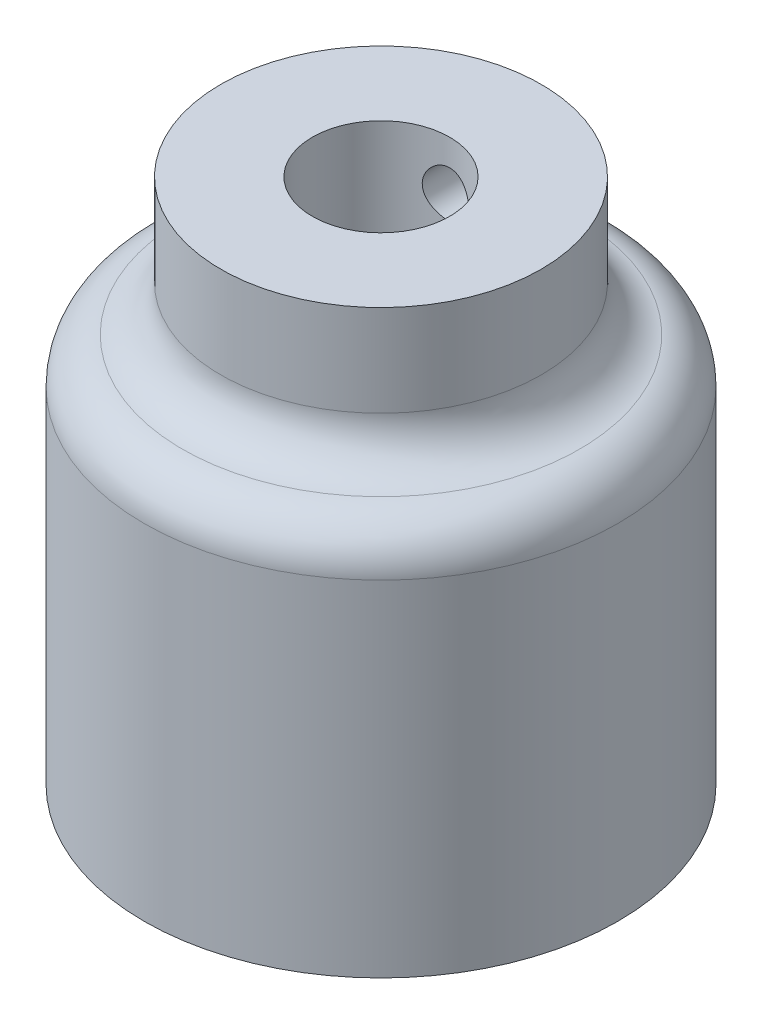
ISO-10303-21;
HEADER;
FILE_DESCRIPTION(('STEP AP214'),'2;1');
FILE_NAME('part.step','',(''),(''),'','','');
FILE_SCHEMA(('AUTOMOTIVE_DESIGN { 1 0 10303 214 1 1 1 1 }'));
ENDSEC;
DATA;
#1=APPLICATION_CONTEXT('core data for automotive mechanical design processes');
#2=APPLICATION_PROTOCOL_DEFINITION('international standard','automotive_design',2000,#1);
#3=PRODUCT_CONTEXT('',#1,'mechanical');
#4=PRODUCT('Part','Part','',(#3));
#5=PRODUCT_RELATED_PRODUCT_CATEGORY('part','',(#4));
#6=PRODUCT_DEFINITION_FORMATION('','',#4);
#7=PRODUCT_DEFINITION_CONTEXT('part definition',#1,'design');
#8=PRODUCT_DEFINITION('design','',#6,#7);
#9=PRODUCT_DEFINITION_SHAPE('','',#8);
#10=(LENGTH_UNIT() NAMED_UNIT(*) SI_UNIT(.MILLI.,.METRE.));
#11=(NAMED_UNIT(*) PLANE_ANGLE_UNIT() SI_UNIT($,.RADIAN.));
#12=(NAMED_UNIT(*) SI_UNIT($,.STERADIAN.) SOLID_ANGLE_UNIT());
#13=UNCERTAINTY_MEASURE_WITH_UNIT(LENGTH_MEASURE(1.E-05),#10,'distance_accuracy_value','');
#14=(GEOMETRIC_REPRESENTATION_CONTEXT(3) GLOBAL_UNCERTAINTY_ASSIGNED_CONTEXT((#13)) GLOBAL_UNIT_ASSIGNED_CONTEXT((#10,
#11,#12)) REPRESENTATION_CONTEXT('',''));
#15=CARTESIAN_POINT('',(0.,0.,0.));
#16=DIRECTION('',(0.,0.,1.));
#17=DIRECTION('',(1.,0.,0.));
#18=AXIS2_PLACEMENT_3D('',#15,#16,#17);
#19=CARTESIAN_POINT('',(5.175,-7.,0.));
#20=DIRECTION('',(0.,1.,0.));
#21=DIRECTION('',(-1.,0.,0.));
#22=AXIS2_PLACEMENT_3D('',#19,#20,#21);
#23=PLANE('',#22);
#24=CARTESIAN_POINT('',(0.,-7.,0.));
#25=DIRECTION('',(0.,1.,0.));
#26=DIRECTION('',(-1.,0.,0.));
#27=AXIS2_PLACEMENT_3D('',#24,#25,#26);
#28=CIRCLE('',#27,5.175);
#29=CARTESIAN_POINT('',(-5.175,-7.,0.));
#30=VERTEX_POINT('',#29);
#31=EDGE_CURVE('E82',#30,#30,#28,.T.);
#32=ORIENTED_EDGE('',*,*,#31,.F.);
#33=EDGE_LOOP('',(#32));
#34=FACE_BOUND('',#33,.T.);
#35=CARTESIAN_POINT('',(0.,-7.,0.));
#36=DIRECTION('',(0.,1.,0.));
#37=DIRECTION('',(-1.,0.,0.));
#38=AXIS2_PLACEMENT_3D('',#35,#36,#37);
#39=CIRCLE('',#38,3.175);
#40=CARTESIAN_POINT('',(-2.31300670124408,-7.,-2.175));
#41=VERTEX_POINT('',#40);
#42=CARTESIAN_POINT('',(2.31300670124407,-7.,-2.175));
#43=VERTEX_POINT('',#42);
#44=EDGE_CURVE('E77',#41,#43,#39,.T.);
#45=ORIENTED_EDGE('',*,*,#44,.T.);
#46=DIRECTION('',(-1.,0.,0.));
#47=VECTOR('',#46,1.);
#48=CARTESIAN_POINT('',(2.31300670124407,-7.,-2.175));
#49=LINE('',#48,#47);
#50=EDGE_CURVE('E60',#43,#41,#49,.T.);
#51=ORIENTED_EDGE('',*,*,#50,.T.);
#52=EDGE_LOOP('',(#45,#51));
#53=FACE_BOUND('',#52,.T.);
#54=ADVANCED_FACE('F33',(#34,#53),#23,.F.);
#55=CARTESIAN_POINT('',(0.,1.5,0.));
#56=DIRECTION('',(0.,1.,0.));
#57=DIRECTION('',(-1.,0.,0.));
#58=AXIS2_PLACEMENT_3D('',#55,#56,#57);
#59=CYLINDRICAL_SURFACE('',#58,3.175);
#60=CARTESIAN_POINT('',(0.,0.,0.));
#61=DIRECTION('',(0.,1.,0.));
#62=DIRECTION('',(-1.,0.,0.));
#63=AXIS2_PLACEMENT_3D('',#60,#61,#62);
#64=CIRCLE('',#63,3.175);
#65=CARTESIAN_POINT('',(-2.31300670124407,0.,-2.175));
#66=VERTEX_POINT('',#65);
#67=CARTESIAN_POINT('',(2.31300670124408,0.,-2.175));
#68=VERTEX_POINT('',#67);
#69=EDGE_CURVE('E75',#66,#68,#64,.T.);
#70=ORIENTED_EDGE('',*,*,#69,.T.);
#71=DIRECTION('',(0.,-1.,0.));
#72=VECTOR('',#71,1.);
#73=CARTESIAN_POINT('',(2.31300670124408,4.73286382647969,-2.175));
#74=LINE('',#73,#72);
#75=EDGE_CURVE('E55',#68,#43,#74,.T.);
#76=ORIENTED_EDGE('',*,*,#75,.T.);
#77=ORIENTED_EDGE('',*,*,#44,.F.);
#78=DIRECTION('',(0.,-1.,0.));
#79=VECTOR('',#78,1.);
#80=CARTESIAN_POINT('',(-2.31300670124407,4.73286382647969,-2.175));
#81=LINE('',#80,#79);
#82=EDGE_CURVE('E67',#66,#41,#81,.T.);
#83=ORIENTED_EDGE('',*,*,#82,.F.);
#84=EDGE_LOOP('',(#70,#76,#77,#83));
#85=FACE_BOUND('',#84,.T.);
#86=ADVANCED_FACE('F74',(#85),#59,.F.);
#87=CARTESIAN_POINT('',(0.,0.,0.));
#88=DIRECTION('',(0.,1.,0.));
#89=DIRECTION('',(-1.,0.,0.));
#90=AXIS2_PLACEMENT_3D('',#87,#88,#89);
#91=PLANE('',#90);
#92=CARTESIAN_POINT('',(0.,0.,0.));
#93=DIRECTION('',(0.,-1.,0.));
#94=DIRECTION('',(1.,0.,0.));
#95=AXIS2_PLACEMENT_3D('',#92,#93,#94);
#96=CIRCLE('',#95,0.75);
#97=CARTESIAN_POINT('',(0.75,0.,0.));
#98=VERTEX_POINT('',#97);
#99=EDGE_CURVE('E108',#98,#98,#96,.T.);
#100=ORIENTED_EDGE('',*,*,#99,.F.);
#101=EDGE_LOOP('',(#100));
#102=FACE_BOUND('',#101,.T.);
#103=ORIENTED_EDGE('',*,*,#69,.F.);
#104=DIRECTION('',(-1.,0.,0.));
#105=VECTOR('',#104,1.);
#106=CARTESIAN_POINT('',(2.31300670124407,0.,-2.175));
#107=LINE('',#106,#105);
#108=EDGE_CURVE('E64',#68,#66,#107,.T.);
#109=ORIENTED_EDGE('',*,*,#108,.F.);
#110=EDGE_LOOP('',(#103,#109));
#111=FACE_BOUND('',#110,.T.);
#112=ADVANCED_FACE('F79',(#102,#111),#91,.F.);
#113=CARTESIAN_POINT('',(1.5,1.5,0.));
#114=DIRECTION('',(0.,-1.,0.));
#115=DIRECTION('',(1.,0.,0.));
#116=AXIS2_PLACEMENT_3D('',#113,#114,#115);
#117=PLANE('',#116);
#118=CARTESIAN_POINT('',(0.,1.5,0.));
#119=DIRECTION('',(0.,-1.,0.));
#120=DIRECTION('',(1.,0.,0.));
#121=AXIS2_PLACEMENT_3D('',#118,#119,#120);
#122=CIRCLE('',#121,0.75);
#123=CARTESIAN_POINT('',(0.750000000000001,1.5,0.));
#124=VERTEX_POINT('',#123);
#125=EDGE_CURVE('E103',#124,#124,#122,.F.);
#126=ORIENTED_EDGE('',*,*,#125,.F.);
#127=EDGE_LOOP('',(#126));
#128=FACE_BOUND('',#127,.T.);
#129=CARTESIAN_POINT('',(0.,1.5,0.));
#130=DIRECTION('',(0.,1.,0.));
#131=DIRECTION('',(-1.,0.,0.));
#132=AXIS2_PLACEMENT_3D('',#129,#130,#131);
#133=CIRCLE('',#132,1.5);
#134=CARTESIAN_POINT('',(-1.5,1.5,0.));
#135=VERTEX_POINT('',#134);
#136=EDGE_CURVE('E80',#135,#135,#133,.T.);
#137=ORIENTED_EDGE('',*,*,#136,.T.);
#138=EDGE_LOOP('',(#137));
#139=FACE_BOUND('',#138,.T.);
#140=ADVANCED_FACE('F152',(#128,#139),#117,.F.);
#141=CARTESIAN_POINT('',(0.,1.5,0.));
#142=DIRECTION('',(0.,1.,0.));
#143=DIRECTION('',(-1.,0.,0.));
#144=AXIS2_PLACEMENT_3D('',#141,#142,#143);
#145=CYLINDRICAL_SURFACE('',#144,1.5);
#146=CARTESIAN_POINT('',(0.51,3.41002917126995,-1.41063815346105));
#147=CARTESIAN_POINT('',(0.510000250362539,3.38228615821199,-1.41063795655266));
#148=CARTESIAN_POINT('',(0.507728612777216,3.35454484462877,-1.41146552477131));
#149=CARTESIAN_POINT('',(0.498734325186416,3.29988634261558,-1.41466829358872));
#150=CARTESIAN_POINT('',(0.492011089203225,3.27296926317022,-1.4170436979333));
#151=CARTESIAN_POINT('',(0.474378873136762,3.22076034589534,-1.42304264661761));
#152=CARTESIAN_POINT('',(0.463478366691018,3.19546533814968,-1.42666366270856));
#153=CARTESIAN_POINT('',(0.437830158861181,3.14705458502146,-1.43474210048494));
#154=CARTESIAN_POINT('',(0.42308155610196,3.12393935195702,-1.4391997180665));
#155=CARTESIAN_POINT('',(0.389512401583829,3.07960291190789,-1.44865266879092));
#156=CARTESIAN_POINT('',(0.370561429629207,3.05848336688016,-1.45366179136794));
#157=CARTESIAN_POINT('',(0.329403573446907,3.0196524766596,-1.46353703529562));
#158=CARTESIAN_POINT('',(0.307196143327182,3.00194170404521,-1.4684031325059));
#159=CARTESIAN_POINT('',(0.259408029858698,2.96996553893202,-1.47760435001814));
#160=CARTESIAN_POINT('',(0.233751872208896,2.9558072732393,-1.48192137178005));
#161=CARTESIAN_POINT('',(0.180249976883174,2.93204804993633,-1.48937505737472));
#162=CARTESIAN_POINT('',(0.152404857301557,2.92244581119643,-1.49251205297287));
#163=CARTESIAN_POINT('',(0.0963818170710223,2.90841774907138,-1.49715452833369));
#164=CARTESIAN_POINT('',(0.0682521628911387,2.90381763911927,-1.49871479625052));
#165=CARTESIAN_POINT('',(0.0115798417599308,2.89936959492493,-1.50022282422114));
#166=CARTESIAN_POINT('',(-0.0169627124837701,2.89952038743206,-1.50017101631426));
#167=CARTESIAN_POINT('',(-0.0724146293315968,2.90446069661314,-1.49849751224118));
#168=CARTESIAN_POINT('',(-0.0993431239350077,2.90906077494271,-1.49693992918067));
#169=CARTESIAN_POINT('',(-0.152020276641209,2.92245498334519,-1.4925109302556));
#170=CARTESIAN_POINT('',(-0.177768853864791,2.93124940045539,-1.48963942447399));
#171=CARTESIAN_POINT('',(-0.227761968402682,2.95288966687461,-1.48282502130136));
#172=CARTESIAN_POINT('',(-0.251981710088433,2.96578825768736,-1.47886827467726));
#173=CARTESIAN_POINT('',(-0.297967991044283,2.99522682255762,-1.47029352603001));
#174=CARTESIAN_POINT('',(-0.319733826486465,3.01176783733588,-1.46567533514977));
#175=CARTESIAN_POINT('',(-0.361319990879173,3.04897011488842,-1.45599657871791));
#176=CARTESIAN_POINT('',(-0.380993302785104,3.06979320340888,-1.45092542374078));
#177=CARTESIAN_POINT('',(-0.416617479209888,3.11448448474904,-1.44110103546442));
#178=CARTESIAN_POINT('',(-0.432567720770661,3.13835318614019,-1.43634785546475));
#179=CARTESIAN_POINT('',(-0.460507767689146,3.18894116272191,-1.42763822143644));
#180=CARTESIAN_POINT('',(-0.472432978064884,3.21569859117772,-1.42369512643878));
#181=CARTESIAN_POINT('',(-0.491557607584663,3.27100985779928,-1.41720651792815));
#182=CARTESIAN_POINT('',(-0.49875910370608,3.29956290038846,-1.41466039026104));
#183=CARTESIAN_POINT('',(-0.507927251671109,3.35622598281415,-1.41139385917052));
#184=CARTESIAN_POINT('',(-0.510122749847268,3.38429439849929,-1.41059371774252));
#185=CARTESIAN_POINT('',(-0.509866695922641,3.44040405669883,-1.41068640636053));
#186=CARTESIAN_POINT('',(-0.507416032206386,3.46844530338244,-1.41157891275831));
#187=CARTESIAN_POINT('',(-0.498143174678911,3.52264423692855,-1.41487660299514));
#188=CARTESIAN_POINT('',(-0.491482626051051,3.54883335629732,-1.41722579441492));
#189=CARTESIAN_POINT('',(-0.474174454724843,3.59971608577264,-1.42310982009317));
#190=CARTESIAN_POINT('',(-0.463526107410059,3.62440942313512,-1.42664486981985));
#191=CARTESIAN_POINT('',(-0.438149697611571,3.6724942969509,-1.4346452029481));
#192=CARTESIAN_POINT('',(-0.423299695813134,3.69581693015855,-1.43913710821967));
#193=CARTESIAN_POINT('',(-0.390078365685957,3.73972181770483,-1.44849446952552));
#194=CARTESIAN_POINT('',(-0.371705959254854,3.76030322976101,-1.45336003965339));
#195=CARTESIAN_POINT('',(-0.330862770173105,3.79921374663584,-1.46321297711608));
#196=CARTESIAN_POINT('',(-0.308232144674053,3.81737714455598,-1.46819413132465));
#197=CARTESIAN_POINT('',(-0.260121406953374,3.84966067847367,-1.47747629159289));
#198=CARTESIAN_POINT('',(-0.234641383307376,3.86378094010652,-1.48177731878477));
#199=CARTESIAN_POINT('',(-0.181668897749942,3.88745181549277,-1.48919655999903));
#200=CARTESIAN_POINT('',(-0.154190112322998,3.89703063278966,-1.49232204866203));
#201=CARTESIAN_POINT('',(-0.0978838802876786,3.91138933527342,-1.49706897685821));
#202=CARTESIAN_POINT('',(-0.0690569467432783,3.91617103079178,-1.49869098375576));
#203=CARTESIAN_POINT('',(-0.0123854196133307,3.92063168817612,-1.5002036605284));
#204=CARTESIAN_POINT('',(0.015438530522049,3.92054810392761,-1.50017489851129));
#205=CARTESIAN_POINT('',(0.0706574996103638,3.91587015203949,-1.49858942594607));
#206=CARTESIAN_POINT('',(0.0980525555502983,3.91127617556855,-1.49703284789948));
#207=CARTESIAN_POINT('',(0.15116848012383,3.89786714036225,-1.49259740617481));
#208=CARTESIAN_POINT('',(0.176909954727729,3.88912553397957,-1.48974158628322));
#209=CARTESIAN_POINT('',(0.226569787639317,3.86773806988082,-1.48300194416869));
#210=CARTESIAN_POINT('',(0.250487811008203,3.85509149702909,-1.47911793366677));
#211=CARTESIAN_POINT('',(0.296809788656567,3.82570279767624,-1.47053732319905));
#212=CARTESIAN_POINT('',(0.319122131033032,3.8088237355306,-1.46581552497808));
#213=CARTESIAN_POINT('',(0.3606747006998,3.77167938990906,-1.45614892862561));
#214=CARTESIAN_POINT('',(0.379913923957676,3.75141300415303,-1.45120405828717));
#215=CARTESIAN_POINT('',(0.415581324200931,3.70707200255941,-1.4414051296965));
#216=CARTESIAN_POINT('',(0.431861075853036,3.68287491157676,-1.43656320117373));
#217=CARTESIAN_POINT('',(0.460113914683306,3.63193651731643,-1.42776579811822));
#218=CARTESIAN_POINT('',(0.472087908674482,3.6051957512507,-1.42381013699958));
#219=CARTESIAN_POINT('',(0.491010946136328,3.55078144392189,-1.41739394780792));
#220=CARTESIAN_POINT('',(0.498107611340482,3.52316456726619,-1.41488989303526));
#221=CARTESIAN_POINT('',(0.507601108063026,3.46704068894445,-1.41151240982704));
#222=CARTESIAN_POINT('',(0.509999742762275,3.4385340330599,-1.41063835577673));
#223=CARTESIAN_POINT('',(0.51,3.41002917126995,-1.41063815346105));
#224=B_SPLINE_CURVE_WITH_KNOTS('',3,(#146,#147,#148,#149,#150,#151,#152,#153,#154,#155,#156,
#157,#158,#159,#160,#161,#162,#163,#164,#165,#166,#167,#168,#169,#170,#171,#172,#173,#174,#175,
#176,#177,#178,#179,#180,#181,#182,#183,#184,#185,#186,#187,#188,#189,#190,#191,#192,#193,#194,
#195,#196,#197,#198,#199,#200,#201,#202,#203,#204,#205,#206,#207,#208,#209,#210,#211,#212,#213,
#214,#215,#216,#217,#218,#219,#220,#221,#222,#223),.UNSPECIFIED.,.T.,.F.,(4,2,2,2,2,2,2,2,2,2,2,
2,2,2,2,2,2,2,2,2,2,2,2,2,2,2,2,2,2,2,2,2,2,2,2,2,2,2,4),(0.,0.0831233904341388,
0.166257724834028,0.249224305459463,0.332210337587631,0.418265430827458,0.504334966324991,
0.592751630209205,0.681143417059092,0.766345606875663,0.8515249625419,0.933230330409288,
1.01494129054166,1.09774785076736,1.18057810142104,1.26745539799595,1.35434722080181,
1.44257369317671,1.53076134706469,1.61482899875747,1.698880577642,1.77988608326181,
1.86090631540829,1.94457396479596,2.02826726334037,2.11617697346757,2.20408395161625,
2.2914376123012,2.3787582951625,2.46182097191522,2.54487644560319,2.62651302668317,
2.70816456714663,2.79290757343779,2.87767821011228,2.96594048685862,3.05418416424844,
3.13962299891842,3.22502903433672),.UNSPECIFIED.);
#225=CARTESIAN_POINT('',(0.51,3.41002917126995,-1.41063815346105));
#226=VERTEX_POINT('',#225);
#227=EDGE_CURVE('E101',#226,#226,#224,.T.);
#228=ORIENTED_EDGE('',*,*,#227,.T.);
#229=EDGE_LOOP('',(#228));
#230=FACE_BOUND('',#229,.T.);
#231=ORIENTED_EDGE('',*,*,#136,.F.);
#232=EDGE_LOOP('',(#231));
#233=FACE_BOUND('',#232,.T.);
#234=CARTESIAN_POINT('',(0.,4.5,0.));
#235=DIRECTION('',(0.,1.,0.));
#236=DIRECTION('',(-1.,0.,0.));
#237=AXIS2_PLACEMENT_3D('',#234,#235,#236);
#238=CIRCLE('',#237,1.5);
#239=CARTESIAN_POINT('',(-1.5,4.5,0.));
#240=VERTEX_POINT('',#239);
#241=EDGE_CURVE('E85',#240,#240,#238,.T.);
#242=ORIENTED_EDGE('',*,*,#241,.T.);
#243=EDGE_LOOP('',(#242));
#244=FACE_BOUND('',#243,.T.);
#245=ADVANCED_FACE('F147',(#230,#233,#244),#145,.F.);
#246=CARTESIAN_POINT('',(3.5,4.5,0.));
#247=DIRECTION('',(0.,-1.,0.));
#248=DIRECTION('',(1.,0.,0.));
#249=AXIS2_PLACEMENT_3D('',#246,#247,#248);
#250=PLANE('',#249);
#251=ORIENTED_EDGE('',*,*,#241,.F.);
#252=EDGE_LOOP('',(#251));
#253=FACE_BOUND('',#252,.T.);
#254=CARTESIAN_POINT('',(0.,4.5,0.));
#255=DIRECTION('',(0.,1.,0.));
#256=DIRECTION('',(-1.,0.,0.));
#257=AXIS2_PLACEMENT_3D('',#254,#255,#256);
#258=CIRCLE('',#257,3.5);
#259=CARTESIAN_POINT('',(-3.5,4.5,0.));
#260=VERTEX_POINT('',#259);
#261=EDGE_CURVE('E177',#260,#260,#258,.T.);
#262=ORIENTED_EDGE('',*,*,#261,.T.);
#263=EDGE_LOOP('',(#262));
#264=FACE_BOUND('',#263,.T.);
#265=ADVANCED_FACE('F144',(#253,#264),#250,.F.);
#266=CARTESIAN_POINT('',(0.,1.5,0.));
#267=DIRECTION('',(0.,1.,0.));
#268=DIRECTION('',(-1.,0.,0.));
#269=AXIS2_PLACEMENT_3D('',#266,#267,#268);
#270=CYLINDRICAL_SURFACE('',#269,3.5);
#271=CARTESIAN_POINT('',(0.51,3.41002917126995,-3.46264349883149));
#272=CARTESIAN_POINT('',(0.509998816631021,3.43851246269911,-3.46264396426921));
#273=CARTESIAN_POINT('',(0.507605763871596,3.46701252240598,-3.46299875069657));
#274=CARTESIAN_POINT('',(0.498098937464546,3.52321648766001,-3.46437867947653));
#275=CARTESIAN_POINT('',(0.49098049882927,3.55091957819897,-3.46540448425615));
#276=CARTESIAN_POINT('',(0.472239808317127,3.60470789392725,-3.46800785316751));
#277=CARTESIAN_POINT('',(0.460620939142902,3.6307943172254,-3.46958500279995));
#278=CARTESIAN_POINT('',(0.433217046192607,3.68064336547133,-3.47311286303971));
#279=CARTESIAN_POINT('',(0.41743262134955,3.7044063238195,-3.47506351993224));
#280=CARTESIAN_POINT('',(0.382018155597488,3.74911748062862,-3.47913510085741));
#281=CARTESIAN_POINT('',(0.36236283648995,3.77004556268779,-3.48125708688015));
#282=CARTESIAN_POINT('',(0.319819086914788,3.8083186702323,-3.48542274097454));
#283=CARTESIAN_POINT('',(0.296930482001415,3.82566350226583,-3.4874664048129));
#284=CARTESIAN_POINT('',(0.24844141280899,3.85635163291494,-3.49125622186624));
#285=CARTESIAN_POINT('',(0.222829140377005,3.8696764600684,-3.49300098628778));
#286=CARTESIAN_POINT('',(0.169700479549025,3.89182784347587,-3.49598466956653));
#287=CARTESIAN_POINT('',(0.142184186297251,3.90065462431387,-3.49722361367834));
#288=CARTESIAN_POINT('',(0.0862355299823468,3.91349852001476,-3.49904857071261));
#289=CARTESIAN_POINT('',(0.0578110431856521,3.91754928503223,-3.49963914973295));
#290=CARTESIAN_POINT('',(0.000680077365948331,3.92083061223649,-3.50011647377609));
#291=CARTESIAN_POINT('',(-0.0280263867432781,3.92006142799445,-3.50000325582472));
#292=CARTESIAN_POINT('',(-0.0846769719491115,3.91375132200273,-3.49908939920179));
#293=CARTESIAN_POINT('',(-0.1126252212725,3.90824660013877,-3.49829397565602));
#294=CARTESIAN_POINT('',(-0.167197023058275,3.89267845688422,-3.49611089621821));
#295=CARTESIAN_POINT('',(-0.193820542983806,3.88261492358533,-3.49472322578793));
#296=CARTESIAN_POINT('',(-0.245097169803634,3.85817750218212,-3.49150259757891));
#297=CARTESIAN_POINT('',(-0.269742873496849,3.84378829648365,-3.48966806186404));
#298=CARTESIAN_POINT('',(-0.31628353631474,3.81111916237405,-3.48575830843001));
#299=CARTESIAN_POINT('',(-0.338178324296579,3.79283899208459,-3.48368307575179));
#300=CARTESIAN_POINT('',(-0.378808902261868,3.75270497090203,-3.4795007771304));
#301=CARTESIAN_POINT('',(-0.397513484191782,3.73081952415462,-3.47739359450339));
#302=CARTESIAN_POINT('',(-0.430989210755113,3.68420376228179,-3.47340371840346));
#303=CARTESIAN_POINT('',(-0.445760333679334,3.65947343145622,-3.47152102616956));
#304=CARTESIAN_POINT('',(-0.470953609554941,3.60783824711134,-3.4681933445749));
#305=CARTESIAN_POINT('',(-0.481372685415891,3.58093187102123,-3.46674866510579));
#306=CARTESIAN_POINT('',(-0.497535399427678,3.52572542728198,-3.46446616080491));
#307=CARTESIAN_POINT('',(-0.503279347640701,3.49742545219068,-3.46362829572862));
#308=CARTESIAN_POINT('',(-0.509886227538903,3.44051243043263,-3.46266187397903));
#309=CARTESIAN_POINT('',(-0.51079333964262,3.41190461771808,-3.46252689727982));
#310=CARTESIAN_POINT('',(-0.507817907473861,3.35494538665809,-3.46296450255158));
#311=CARTESIAN_POINT('',(-0.503935503170269,3.32659396084439,-3.46353706384546));
#312=CARTESIAN_POINT('',(-0.491528667196635,3.27108834291503,-3.46531934188953));
#313=CARTESIAN_POINT('',(-0.483026132506918,3.24392915133945,-3.46652605222788));
#314=CARTESIAN_POINT('',(-0.461643125274951,3.19142151853074,-3.46943819179489));
#315=CARTESIAN_POINT('',(-0.448762447779375,3.16607316213518,-3.47114364437056));
#316=CARTESIAN_POINT('',(-0.41888218684794,3.11770835940569,-3.47487627982506));
#317=CARTESIAN_POINT('',(-0.401853935317295,3.09470979750227,-3.47690566654825));
#318=CARTESIAN_POINT('',(-0.364201871796003,3.0518810251106,-3.48105082230363));
#319=CARTESIAN_POINT('',(-0.343577868291308,3.03205098348939,-3.4831665959323));
#320=CARTESIAN_POINT('',(-0.299125457501195,2.99596412554714,-3.48726613455755));
#321=CARTESIAN_POINT('',(-0.275273194586476,2.97973654321651,-3.48924873451498));
#322=CARTESIAN_POINT('',(-0.225155607224688,2.95151866345946,-3.49284056702116));
#323=CARTESIAN_POINT('',(-0.198890345753218,2.93952825548878,-3.49444980931012));
#324=CARTESIAN_POINT('',(-0.144784681645204,2.92017208810621,-3.49710849260562));
#325=CARTESIAN_POINT('',(-0.116950156874642,2.91279017803755,-3.49815988664511));
#326=CARTESIAN_POINT('',(-0.0604201853122896,2.90280822915073,-3.49959259267452));
#327=CARTESIAN_POINT('',(-0.0317247921542275,2.90020789305765,-3.49997394632141));
#328=CARTESIAN_POINT('',(0.0254284779475163,2.89986984877506,-3.50002322684143));
#329=CARTESIAN_POINT('',(0.0538860944776058,2.90208734786856,-3.4996977255498));
#330=CARTESIAN_POINT('',(0.110019279316781,2.91122622640009,-3.49838308482056));
#331=CARTESIAN_POINT('',(0.137694849724573,2.91814759321354,-3.49739394716408));
#332=CARTESIAN_POINT('',(0.191467202650606,2.93648216909703,-3.49486265158433));
#333=CARTESIAN_POINT('',(0.217565001735625,2.94789244957178,-3.49332085427784));
#334=CARTESIAN_POINT('',(0.267482661136482,2.97487621580276,-3.48985383672792));
#335=CARTESIAN_POINT('',(0.291302455897886,2.99044982131864,-3.48792860545528));
#336=CARTESIAN_POINT('',(0.336215476636496,3.0254808526164,-3.48388760687417));
#337=CARTESIAN_POINT('',(0.357282727350221,3.04497140695123,-3.48177030512947));
#338=CARTESIAN_POINT('',(0.395864020188226,3.08721341765271,-3.47759532524224));
#339=CARTESIAN_POINT('',(0.413377226234136,3.10996563917365,-3.47553766122667));
#340=CARTESIAN_POINT('',(0.444435790525054,3.15822600420562,-3.47170329064183));
#341=CARTESIAN_POINT('',(0.457959696031218,3.18374807332858,-3.4699281259318));
#342=CARTESIAN_POINT('',(0.480508979981729,3.23671479017025,-3.46687780679588));
#343=CARTESIAN_POINT('',(0.489539068391698,3.26415739041458,-3.4656021291584));
#344=CARTESIAN_POINT('',(0.500774131713233,3.31144392011603,-3.46399273943564));
#345=CARTESIAN_POINT('',(0.504228598474817,3.33099455493036,-3.46348942639151));
#346=CARTESIAN_POINT('',(0.508841931006685,3.37037047568188,-3.46281464601091));
#347=CARTESIAN_POINT('',(0.510000824000472,3.39019575835917,-3.46264317473909));
#348=CARTESIAN_POINT('',(0.51,3.41002917126995,-3.46264349883149));
#349=B_SPLINE_CURVE_WITH_KNOTS('',3,(#271,#272,#273,#274,#275,#276,#277,#278,#279,#280,#281,
#282,#283,#284,#285,#286,#287,#288,#289,#290,#291,#292,#293,#294,#295,#296,#297,#298,#299,#300,
#301,#302,#303,#304,#305,#306,#307,#308,#309,#310,#311,#312,#313,#314,#315,#316,#317,#318,#319,
#320,#321,#322,#323,#324,#325,#326,#327,#328,#329,#330,#331,#332,#333,#334,#335,#336,#337,#338,
#339,#340,#341,#342,#343,#344,#345,#346,#347,#348),.UNSPECIFIED.,.T.,.F.,(4,2,2,2,2,2,2,2,2,2,2,
2,2,2,2,2,2,2,2,2,2,2,2,2,2,2,2,2,2,2,2,2,2,2,2,2,2,2,4),(0.,0.0853773883782697,
0.170839188478569,0.256236876353872,0.341622292239998,0.427584987452549,0.513552322390535,
0.599908853367638,0.686261072207139,0.772001176797924,0.857736770752801,0.942822741254082,
1.02791080053268,1.11330378628878,1.19870208197461,1.28489304169935,1.37108447711166,
1.45733675095867,1.5435833039462,1.62904070070274,1.71449560011045,1.79954897675663,
1.88460633554197,1.97026918304534,2.05593659444892,2.14227566126618,2.22861247540463,
2.31464499489053,2.40067216547356,2.4859029432527,2.57113349228401,2.65630852833984,
2.74148601475192,2.82741676734572,2.91336771151786,2.99977277185999,3.08608707939619,
3.14553754995986,3.20498731548856),.UNSPECIFIED.);
#350=CARTESIAN_POINT('',(0.51,3.41002917126995,-3.46264349883149));
#351=VERTEX_POINT('',#350);
#352=EDGE_CURVE('E37',#351,#351,#349,.T.);
#353=ORIENTED_EDGE('',*,*,#352,.T.);
#354=EDGE_LOOP('',(#353));
#355=FACE_BOUND('',#354,.T.);
#356=CARTESIAN_POINT('',(0.,2.5,0.));
#357=DIRECTION('',(0.,-1.,0.));
#358=DIRECTION('',(1.,0.,0.));
#359=AXIS2_PLACEMENT_3D('',#356,#357,#358);
#360=CIRCLE('',#359,3.5);
#361=CARTESIAN_POINT('',(3.5,2.5,0.));
#362=VERTEX_POINT('',#361);
#363=EDGE_CURVE('E91',#362,#362,#360,.F.);
#364=ORIENTED_EDGE('',*,*,#363,.T.);
#365=EDGE_LOOP('',(#364));
#366=FACE_BOUND('',#365,.T.);
#367=ORIENTED_EDGE('',*,*,#261,.F.);
#368=EDGE_LOOP('',(#367));
#369=FACE_BOUND('',#368,.T.);
#370=ADVANCED_FACE('F139',(#355,#366,#369),#270,.T.);
#371=CARTESIAN_POINT('',(0.,1.5,0.));
#372=DIRECTION('',(0.,1.,0.));
#373=DIRECTION('',(-1.,0.,0.));
#374=AXIS2_PLACEMENT_3D('',#371,#372,#373);
#375=CYLINDRICAL_SURFACE('',#374,5.175);
#376=CARTESIAN_POINT('',(1.51,-3.16893055648828,-4.94980050103032));
#377=CARTESIAN_POINT('',(1.50999869356233,-3.2517866322177,-4.9498015431846));
#378=CARTESIAN_POINT('',(1.50315712627138,-3.33465576007355,-4.95190369049438));
#379=CARTESIAN_POINT('',(1.47603726629021,-3.49797881125461,-4.9600537734361));
#380=CARTESIAN_POINT('',(1.45575392172883,-3.57843181463107,-4.96610319257215));
#381=CARTESIAN_POINT('',(1.40249178569782,-3.734535184347,-4.98140561608825));
#382=CARTESIAN_POINT('',(1.36953326119554,-3.81019299415014,-4.9906535039151));
#383=CARTESIAN_POINT('',(1.29192221060603,-3.95492239626834,-5.01130404304242));
#384=CARTESIAN_POINT('',(1.24726814209953,-4.02399311823192,-5.02270697849733));
#385=CARTESIAN_POINT('',(1.14610271939569,-4.15565539268775,-5.04676557418098));
#386=CARTESIAN_POINT('',(1.08930277714345,-4.21802057928417,-5.05944681218425));
#387=CARTESIAN_POINT('',(0.966076974652596,-4.33248918997947,-5.08441409355877));
#388=CARTESIAN_POINT('',(0.899649943606235,-4.38459136411131,-5.09670008863977));
#389=CARTESIAN_POINT('',(0.757455669795199,-4.47802787029381,-5.11978181997057));
#390=CARTESIAN_POINT('',(0.681531791755517,-4.51913287243451,-5.13054389440437));
#391=CARTESIAN_POINT('',(0.523482457572963,-4.58790513279077,-5.14906897111183));
#392=CARTESIAN_POINT('',(0.441358267135657,-4.61557512504834,-5.15683258351057));
#393=CARTESIAN_POINT('',(0.275606414293961,-4.65594703903807,-5.16830504139806));
#394=CARTESIAN_POINT('',(0.192080137113921,-4.66903501629322,-5.17211826957942));
#395=CARTESIAN_POINT('',(0.0239361059712578,-4.68109052464057,-5.17562723294334));
#396=CARTESIAN_POINT('',(-0.0606814273596135,-4.68006086669111,-5.17532378779568));
#397=CARTESIAN_POINT('',(-0.225903109854494,-4.66417274024871,-5.1707080737768));
#398=CARTESIAN_POINT('',(-0.306551348738206,-4.64973207710507,-5.16651692669694));
#399=CARTESIAN_POINT('',(-0.464225587730784,-4.60811241157873,-5.15474282758855));
#400=CARTESIAN_POINT('',(-0.541251363143218,-4.58093262014912,-5.14715966546384));
#401=CARTESIAN_POINT('',(-0.690506058844016,-4.51431394289888,-5.12928303047899));
#402=CARTESIAN_POINT('',(-0.762671321817944,-4.47474068189553,-5.11896004810336));
#403=CARTESIAN_POINT('',(-0.899472836934959,-4.38456382664298,-5.09670325877989));
#404=CARTESIAN_POINT('',(-0.964107375987145,-4.33395773012957,-5.08476908664589));
#405=CARTESIAN_POINT('',(-1.08650676066674,-4.22097138143602,-5.06005654171352));
#406=CARTESIAN_POINT('',(-1.14393420894426,-4.15822841332296,-5.04726325618534));
#407=CARTESIAN_POINT('',(-1.24754418213011,-4.02387539113832,-5.02265884416608));
#408=CARTESIAN_POINT('',(-1.29372571136132,-3.95226455278045,-5.01084780470078));
#409=CARTESIAN_POINT('',(-1.37385964824937,-3.80136096255621,-4.98947662063651));
#410=CARTESIAN_POINT('',(-1.40770295627923,-3.72200718834632,-4.97993680406098));
#411=CARTESIAN_POINT('',(-1.46144938297904,-3.55838501553307,-4.96443169645348));
#412=CARTESIAN_POINT('',(-1.48135676220565,-3.47411812753188,-4.95846531301563));
#413=CARTESIAN_POINT('',(-1.5060482946308,-3.30625886495769,-4.95102060489039));
#414=CARTESIAN_POINT('',(-1.51134288639557,-3.22274822156917,-4.94939087279052));
#415=CARTESIAN_POINT('',(-1.508079132791,-3.05603099447456,-4.95038643126534));
#416=CARTESIAN_POINT('',(-1.4995226028682,-2.97282437235341,-4.95301116421349));
#417=CARTESIAN_POINT('',(-1.46925298095589,-2.81116363577555,-4.96207189221198));
#418=CARTESIAN_POINT('',(-1.44786291501762,-2.73264325980117,-4.96841422604889));
#419=CARTESIAN_POINT('',(-1.39290501624645,-2.58030929068822,-4.9840999069449));
#420=CARTESIAN_POINT('',(-1.35933537365716,-2.50649639894952,-4.99344369996546));
#421=CARTESIAN_POINT('',(-1.27998582335079,-2.36358137566815,-5.01437746012689));
#422=CARTESIAN_POINT('',(-1.23391498959321,-2.29464849164307,-5.02601886364363));
#423=CARTESIAN_POINT('',(-1.13122013625666,-2.16530531856988,-5.05012304855634));
#424=CARTESIAN_POINT('',(-1.07459372908143,-2.10489696315243,-5.06258601537107));
#425=CARTESIAN_POINT('',(-0.95000516974526,-1.9921143791604,-5.08746342472689));
#426=CARTESIAN_POINT('',(-0.88171251092735,-1.9401005679983,-5.09986050812369));
#427=CARTESIAN_POINT('',(-0.737076203458511,-1.84826586987483,-5.12276259458625));
#428=CARTESIAN_POINT('',(-0.660732968716327,-1.80844435647457,-5.13326769485047));
#429=CARTESIAN_POINT('',(-0.502682715405247,-1.742507282534,-5.15113624627814));
#430=CARTESIAN_POINT('',(-0.42102164926667,-1.71628829717266,-5.15852332219155));
#431=CARTESIAN_POINT('',(-0.254199918138031,-1.67802464440566,-5.16942787062162));
#432=CARTESIAN_POINT('',(-0.169040201948834,-1.66597616001286,-5.17294638516304));
#433=CARTESIAN_POINT('',(-0.000978142939541445,-1.65667295416087,-5.17565754092744));
#434=CARTESIAN_POINT('',(0.0818930879498566,-1.65889412916258,-5.17500344243858));
#435=CARTESIAN_POINT('',(0.24603167897058,-1.67682352499755,-5.16980034243096));
#436=CARTESIAN_POINT('',(0.327299121511933,-1.69253105098439,-5.16525154157584));
#437=CARTESIAN_POINT('',(0.485162626103361,-1.73666946048145,-5.15281060058233));
#438=CARTESIAN_POINT('',(0.561796280740927,-1.76497575808018,-5.1449512375528));
#439=CARTESIAN_POINT('',(0.709268081098368,-1.83339719303836,-5.12670371144384));
#440=CARTESIAN_POINT('',(0.780105302905397,-1.8735142082803,-5.11631514627139));
#441=CARTESIAN_POINT('',(0.916335894193425,-1.96584866322206,-5.09370894261367));
#442=CARTESIAN_POINT('',(0.981495327168273,-2.01839982218444,-5.08144493699626));
#443=CARTESIAN_POINT('',(1.10224675303192,-2.13350178875926,-5.05662780626583));
#444=CARTESIAN_POINT('',(1.15783604711628,-2.19605540753068,-5.04407460072555));
#445=CARTESIAN_POINT('',(1.25941267316232,-2.33147040046379,-5.01969263636181));
#446=CARTESIAN_POINT('',(1.30509091519688,-2.40456955208178,-5.00789362844993));
#447=CARTESIAN_POINT('',(1.38345276617079,-2.55774334970443,-4.98681661674859));
#448=CARTESIAN_POINT('',(1.41614322288721,-2.6378142926259,-4.9775372852852));
#449=CARTESIAN_POINT('',(1.46430707060352,-2.79256873742526,-4.96356511618651));
#450=CARTESIAN_POINT('',(1.48139658842578,-2.86671434030028,-4.9584502846295));
#451=CARTESIAN_POINT('',(1.50424266206098,-3.01688003750256,-4.95156779143157));
#452=CARTESIAN_POINT('',(1.51000119881905,-3.0928998018251,-4.94979954472415));
#453=CARTESIAN_POINT('',(1.51,-3.16893055648828,-4.94980050103032));
#454=B_SPLINE_CURVE_WITH_KNOTS('',3,(#376,#377,#378,#379,#380,#381,#382,#383,#384,#385,#386,
#387,#388,#389,#390,#391,#392,#393,#394,#395,#396,#397,#398,#399,#400,#401,#402,#403,#404,#405,
#406,#407,#408,#409,#410,#411,#412,#413,#414,#415,#416,#417,#418,#419,#420,#421,#422,#423,#424,
#425,#426,#427,#428,#429,#430,#431,#432,#433,#434,#435,#436,#437,#438,#439,#440,#441,#442,#443,
#444,#445,#446,#447,#448,#449,#450,#451,#452,#453),.UNSPECIFIED.,.T.,.F.,(4,2,2,2,2,2,2,2,2,2,2,
2,2,2,2,2,2,2,2,2,2,2,2,2,2,2,2,2,2,2,2,2,2,2,2,2,2,2,4),(0.,0.248287998111175,
0.496669364148714,0.744655221238304,0.992673799416895,1.24741499535508,1.50218719792888,
1.76191840340486,2.02159673106652,2.27422346954134,2.52679990830866,2.77176242699048,
3.01674012037382,3.264471716181,3.51225955645757,3.76910328601905,4.02596974742829,
4.28505538883449,4.54406178674586,4.79389891440761,5.04370329892868,5.28746929817978,
5.53127153332671,5.78132308774354,6.03143127084183,6.29039953985732,6.54935450087844,
6.80631056373873,7.06319739666986,7.31070448554534,7.55819882307706,7.80329832774684,
8.04843682385495,8.30110224488641,8.55383880193254,8.81358537681181,9.07319481863765,
9.30106977950433,9.5289048984623),.UNSPECIFIED.);
#455=CARTESIAN_POINT('',(1.51,-3.16893055648828,-4.94980050103032));
#456=VERTEX_POINT('',#455);
#457=EDGE_CURVE('E97',#456,#456,#454,.T.);
#458=ORIENTED_EDGE('',*,*,#457,.F.);
#459=EDGE_LOOP('',(#458));
#460=FACE_BOUND('',#459,.T.);
#461=CARTESIAN_POINT('',(0.,0.526582912813411,0.));
#462=DIRECTION('',(0.,-1.,0.));
#463=DIRECTION('',(1.,0.,0.));
#464=AXIS2_PLACEMENT_3D('',#461,#462,#463);
#465=CIRCLE('',#464,5.175);
#466=CARTESIAN_POINT('',(5.175,0.526582912813409,0.));
#467=VERTEX_POINT('',#466);
#468=EDGE_CURVE('E11',#467,#467,#465,.T.);
#469=ORIENTED_EDGE('',*,*,#468,.T.);
#470=EDGE_LOOP('',(#469));
#471=FACE_BOUND('',#470,.T.);
#472=ORIENTED_EDGE('',*,*,#31,.T.);
#473=EDGE_LOOP('',(#472));
#474=FACE_BOUND('',#473,.T.);
#475=ADVANCED_FACE('F136',(#460,#471,#474),#375,.T.);
#476=CARTESIAN_POINT('',(0.,2.5,0.));
#477=DIRECTION('',(0.,-1.,0.));
#478=DIRECTION('',(1.,0.,0.));
#479=AXIS2_PLACEMENT_3D('',#476,#477,#478);
#480=TOROIDAL_SURFACE('',#479,4.5,1.);
#481=CARTESIAN_POINT('',(0.,1.51329145640666,0.));
#482=DIRECTION('',(0.,1.,0.));
#483=DIRECTION('',(-1.,0.,0.));
#484=AXIS2_PLACEMENT_3D('',#481,#482,#483);
#485=CIRCLE('',#484,4.33749999999999);
#486=CARTESIAN_POINT('',(-4.33749999999999,1.51329145640666,0.));
#487=VERTEX_POINT('',#486);
#488=EDGE_CURVE('E47',#487,#487,#485,.T.);
#489=ORIENTED_EDGE('',*,*,#488,.T.);
#490=EDGE_LOOP('',(#489));
#491=FACE_BOUND('',#490,.T.);
#492=ORIENTED_EDGE('',*,*,#363,.F.);
#493=EDGE_LOOP('',(#492));
#494=FACE_BOUND('',#493,.T.);
#495=ADVANCED_FACE('F138',(#491,#494),#480,.F.);
#496=CARTESIAN_POINT('',(0.,0.526582912813411,0.));
#497=DIRECTION('',(0.,-1.,0.));
#498=DIRECTION('',(1.,0.,0.));
#499=AXIS2_PLACEMENT_3D('',#496,#497,#498);
#500=TOROIDAL_SURFACE('',#499,4.175,1.);
#501=ORIENTED_EDGE('',*,*,#468,.F.);
#502=EDGE_LOOP('',(#501));
#503=FACE_BOUND('',#502,.T.);
#504=ORIENTED_EDGE('',*,*,#488,.F.);
#505=EDGE_LOOP('',(#504));
#506=FACE_BOUND('',#505,.T.);
#507=ADVANCED_FACE('F35',(#503,#506),#500,.T.);
#508=CARTESIAN_POINT('',(2.31300670124408,4.73286382647969,-2.175));
#509=DIRECTION('',(0.,0.,1.));
#510=DIRECTION('',(1.,0.,0.));
#511=AXIS2_PLACEMENT_3D('',#508,#509,#510);
#512=PLANE('',#511);
#513=CARTESIAN_POINT('',(0.,-3.16893055648828,-2.175));
#514=DIRECTION('',(0.,0.,1.));
#515=DIRECTION('',(1.,0.,0.));
#516=AXIS2_PLACEMENT_3D('',#513,#514,#515);
#517=CIRCLE('',#516,1.51);
#518=CARTESIAN_POINT('',(1.51,-3.16893055648828,-2.175));
#519=VERTEX_POINT('',#518);
#520=EDGE_CURVE('E95',#519,#519,#517,.T.);
#521=ORIENTED_EDGE('',*,*,#520,.F.);
#522=EDGE_LOOP('',(#521));
#523=FACE_BOUND('',#522,.T.);
#524=ORIENTED_EDGE('',*,*,#75,.F.);
#525=ORIENTED_EDGE('',*,*,#108,.T.);
#526=ORIENTED_EDGE('',*,*,#82,.T.);
#527=ORIENTED_EDGE('',*,*,#50,.F.);
#528=EDGE_LOOP('',(#524,#525,#526,#527));
#529=FACE_BOUND('',#528,.T.);
#530=ADVANCED_FACE('F66',(#523,#529),#512,.T.);
#531=CARTESIAN_POINT('',(0.,-3.16893055648828,-5.176));
#532=DIRECTION('',(0.,0.,1.));
#533=DIRECTION('',(1.,0.,0.));
#534=AXIS2_PLACEMENT_3D('',#531,#532,#533);
#535=CYLINDRICAL_SURFACE('',#534,1.51);
#536=ORIENTED_EDGE('',*,*,#520,.T.);
#537=EDGE_LOOP('',(#536));
#538=FACE_BOUND('',#537,.T.);
#539=ORIENTED_EDGE('',*,*,#457,.T.);
#540=EDGE_LOOP('',(#539));
#541=FACE_BOUND('',#540,.T.);
#542=ADVANCED_FACE('F122',(#538,#541),#535,.F.);
#543=CARTESIAN_POINT('',(0.,3.41002917126995,-5.176));
#544=DIRECTION('',(0.,0.,1.));
#545=DIRECTION('',(1.,0.,0.));
#546=AXIS2_PLACEMENT_3D('',#543,#544,#545);
#547=CYLINDRICAL_SURFACE('',#546,0.51);
#548=ORIENTED_EDGE('',*,*,#352,.F.);
#549=EDGE_LOOP('',(#548));
#550=FACE_BOUND('',#549,.T.);
#551=ORIENTED_EDGE('',*,*,#227,.F.);
#552=EDGE_LOOP('',(#551));
#553=FACE_BOUND('',#552,.T.);
#554=ADVANCED_FACE('F126',(#550,#553),#547,.F.);
#555=CARTESIAN_POINT('',(0.,3.62132034355964,0.));
#556=DIRECTION('',(0.,-1.,0.));
#557=DIRECTION('',(1.,0.,0.));
#558=AXIS2_PLACEMENT_3D('',#555,#556,#557);
#559=CYLINDRICAL_SURFACE('',#558,0.75);
#560=CARTESIAN_POINT('',(0.750000000000001,1.5,0.));
#561=CARTESIAN_POINT('',(0.750000000000001,1.484375,0.));
#562=CARTESIAN_POINT('',(0.750000000000001,1.46875,0.));
#563=CARTESIAN_POINT('',(0.750000000000001,1.4375,0.));
#564=CARTESIAN_POINT('',(0.750000000000001,1.421875,0.));
#565=CARTESIAN_POINT('',(0.750000000000001,1.390625,0.));
#566=CARTESIAN_POINT('',(0.750000000000001,1.375,0.));
#567=CARTESIAN_POINT('',(0.750000000000001,1.34375,0.));
#568=CARTESIAN_POINT('',(0.750000000000001,1.328125,0.));
#569=CARTESIAN_POINT('',(0.750000000000001,1.296875,0.));
#570=CARTESIAN_POINT('',(0.750000000000001,1.28125,0.));
#571=CARTESIAN_POINT('',(0.750000000000001,1.25,0.));
#572=CARTESIAN_POINT('',(0.750000000000001,1.234375,0.));
#573=CARTESIAN_POINT('',(0.750000000000001,1.203125,0.));
#574=CARTESIAN_POINT('',(0.75,1.1875,0.));
#575=CARTESIAN_POINT('',(0.75,1.15625,0.));
#576=CARTESIAN_POINT('',(0.75,1.140625,0.));
#577=CARTESIAN_POINT('',(0.75,1.109375,0.));
#578=CARTESIAN_POINT('',(0.75,1.09375,0.));
#579=CARTESIAN_POINT('',(0.75,1.0625,0.));
#580=CARTESIAN_POINT('',(0.75,1.046875,0.));
#581=CARTESIAN_POINT('',(0.75,1.015625,0.));
#582=CARTESIAN_POINT('',(0.75,0.999999999999999,0.));
#583=CARTESIAN_POINT('',(0.75,0.96875,0.));
#584=CARTESIAN_POINT('',(0.75,0.953125,0.));
#585=CARTESIAN_POINT('',(0.75,0.921875,0.));
#586=CARTESIAN_POINT('',(0.75,0.90625,0.));
#587=CARTESIAN_POINT('',(0.75,0.874999999999999,0.));
#588=CARTESIAN_POINT('',(0.75,0.859374999999999,0.));
#589=CARTESIAN_POINT('',(0.75,0.828124999999999,0.));
#590=CARTESIAN_POINT('',(0.75,0.812499999999999,0.));
#591=CARTESIAN_POINT('',(0.75,0.781249999999999,0.));
#592=CARTESIAN_POINT('',(0.75,0.765624999999999,0.));
#593=CARTESIAN_POINT('',(0.75,0.734374999999999,0.));
#594=CARTESIAN_POINT('',(0.75,0.718749999999999,0.));
#595=CARTESIAN_POINT('',(0.75,0.687499999999999,0.));
#596=CARTESIAN_POINT('',(0.75,0.671874999999999,0.));
#597=CARTESIAN_POINT('',(0.75,0.640624999999999,0.));
#598=CARTESIAN_POINT('',(0.75,0.624999999999999,0.));
#599=CARTESIAN_POINT('',(0.75,0.593749999999999,0.));
#600=CARTESIAN_POINT('',(0.75,0.578124999999999,0.));
#601=CARTESIAN_POINT('',(0.75,0.546874999999999,0.));
#602=CARTESIAN_POINT('',(0.75,0.531249999999999,0.));
#603=CARTESIAN_POINT('',(0.75,0.499999999999999,0.));
#604=CARTESIAN_POINT('',(0.75,0.484374999999999,0.));
#605=CARTESIAN_POINT('',(0.75,0.453125,0.));
#606=CARTESIAN_POINT('',(0.75,0.4375,0.));
#607=CARTESIAN_POINT('',(0.75,0.40625,0.));
#608=CARTESIAN_POINT('',(0.75,0.390625,0.));
#609=CARTESIAN_POINT('',(0.75,0.359374999999999,0.));
#610=CARTESIAN_POINT('',(0.75,0.343749999999999,0.));
#611=CARTESIAN_POINT('',(0.75,0.312499999999999,0.));
#612=CARTESIAN_POINT('',(0.75,0.296874999999999,0.));
#613=CARTESIAN_POINT('',(0.75,0.265625,0.));
#614=CARTESIAN_POINT('',(0.75,0.25,0.));
#615=CARTESIAN_POINT('',(0.75,0.21875,0.));
#616=CARTESIAN_POINT('',(0.75,0.203125,0.));
#617=CARTESIAN_POINT('',(0.75,0.171875,0.));
#618=CARTESIAN_POINT('',(0.75,0.15625,0.));
#619=CARTESIAN_POINT('',(0.75,0.125,0.));
#620=CARTESIAN_POINT('',(0.75,0.109375,0.));
#621=CARTESIAN_POINT('',(0.75,0.0781249999999996,0.));
#622=CARTESIAN_POINT('',(0.75,0.0624999999999996,0.));
#623=CARTESIAN_POINT('',(0.75,0.0312499999999996,0.));
#624=CARTESIAN_POINT('',(0.75,0.0156249999999996,0.));
#625=CARTESIAN_POINT('',(0.75,0.,0.));
#626=B_SPLINE_CURVE_WITH_KNOTS('',3,(#560,#561,#562,#563,#564,#565,#566,#567,#568,#569,#570,
#571,#572,#573,#574,#575,#576,#577,#578,#579,#580,#581,#582,#583,#584,#585,#586,#587,#588,#589,
#590,#591,#592,#593,#594,#595,#596,#597,#598,#599,#600,#601,#602,#603,#604,#605,#606,#607,#608,
#609,#610,#611,#612,#613,#614,#615,#616,#617,#618,#619,#620,#621,#622,#623,#624,#625),
.UNSPECIFIED.,.F.,.F.,(4,2,2,2,2,2,2,2,2,2,2,2,2,2,2,2,2,2,2,2,2,2,2,2,2,2,2,2,2,2,2,2,4),(0.,
0.046875,0.0937500000000001,0.140625,0.1875,0.234375,0.28125,0.328125,0.375,0.421875,0.46875,
0.515625,0.5625,0.609375,0.65625,0.703125,0.75,0.796875,0.84375,0.890625,0.9375,0.984375,
1.03125,1.078125,1.125,1.171875,1.21875,1.265625,1.3125,1.359375,1.40625,1.453125,1.5),.UNSPECIFIED.);
#627=EDGE_CURVE('BSEAM130',#124,#98,#626,.T.);
#628=ORIENTED_EDGE('',*,*,#125,.T.);
#629=ORIENTED_EDGE('',*,*,#99,.T.);
#630=ORIENTED_EDGE('',*,*,#627,.T.);
#631=ORIENTED_EDGE('',*,*,#627,.F.);
#632=EDGE_LOOP('',(#628,#630,#629,#631));
#633=FACE_BOUND('',#632,.T.);
#634=ADVANCED_FACE('F130',(#633),#559,.F.);
#635=CLOSED_SHELL('',(#54,#86,#112,#140,#245,#265,#370,#475,#495,#507,#530,#542,#554,#634));
#636=MANIFOLD_SOLID_BREP('B2',#635);
#637=ADVANCED_BREP_SHAPE_REPRESENTATION('',(#18,#636),#14);
#638=SHAPE_DEFINITION_REPRESENTATION(#9,#637);
ENDSEC;
END-ISO-10303-21;
